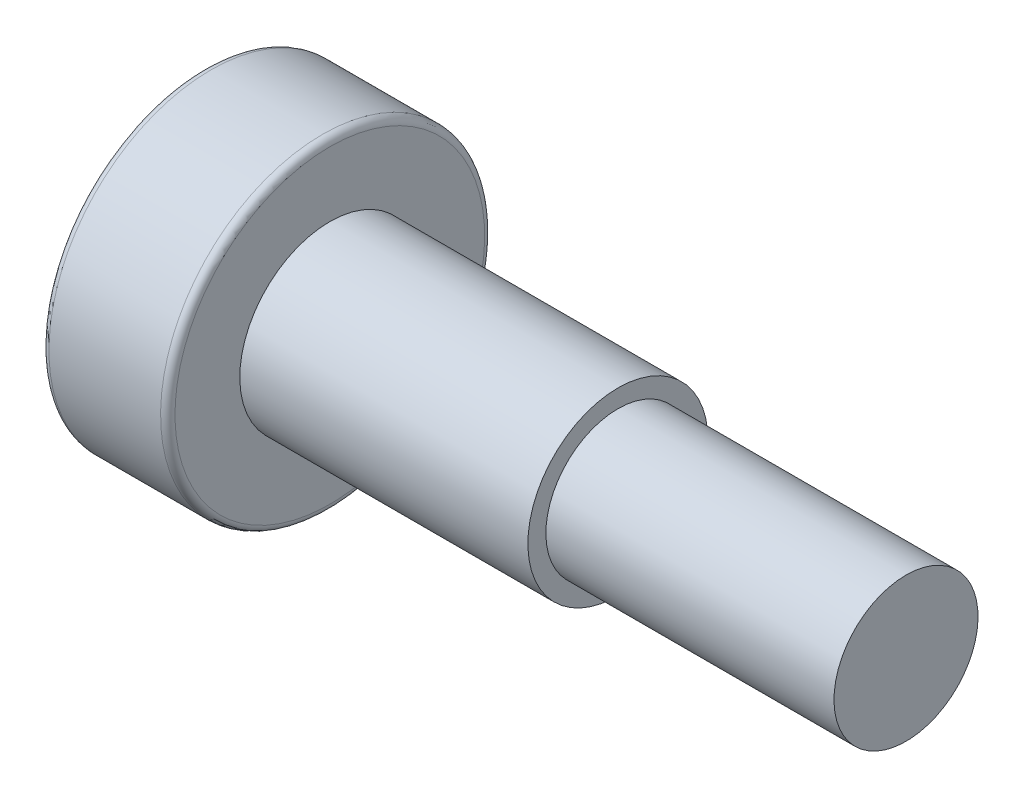
ISO-10303-21;
HEADER;
FILE_DESCRIPTION(('STEP AP214'),'2;1');
FILE_NAME('part.step','',(''),(''),'','','');
FILE_SCHEMA(('AUTOMOTIVE_DESIGN { 1 0 10303 214 1 1 1 1 }'));
ENDSEC;
DATA;
#1=APPLICATION_CONTEXT('core data for automotive mechanical design processes');
#2=APPLICATION_PROTOCOL_DEFINITION('international standard','automotive_design',2000,#1);
#3=PRODUCT_CONTEXT('',#1,'mechanical');
#4=PRODUCT('Part','Part','',(#3));
#5=PRODUCT_RELATED_PRODUCT_CATEGORY('part','',(#4));
#6=PRODUCT_DEFINITION_FORMATION('','',#4);
#7=PRODUCT_DEFINITION_CONTEXT('part definition',#1,'design');
#8=PRODUCT_DEFINITION('design','',#6,#7);
#9=PRODUCT_DEFINITION_SHAPE('','',#8);
#10=(LENGTH_UNIT() NAMED_UNIT(*) SI_UNIT(.MILLI.,.METRE.));
#11=(NAMED_UNIT(*) PLANE_ANGLE_UNIT() SI_UNIT($,.RADIAN.));
#12=(NAMED_UNIT(*) SI_UNIT($,.STERADIAN.) SOLID_ANGLE_UNIT());
#13=UNCERTAINTY_MEASURE_WITH_UNIT(LENGTH_MEASURE(1.E-05),#10,'distance_accuracy_value','');
#14=(GEOMETRIC_REPRESENTATION_CONTEXT(3) GLOBAL_UNCERTAINTY_ASSIGNED_CONTEXT((#13)) GLOBAL_UNIT_ASSIGNED_CONTEXT((#10,
#11,#12)) REPRESENTATION_CONTEXT('',''));
#15=CARTESIAN_POINT('',(0.,0.,0.));
#16=DIRECTION('',(0.,0.,1.));
#17=DIRECTION('',(1.,0.,0.));
#18=AXIS2_PLACEMENT_3D('',#15,#16,#17);
#19=CARTESIAN_POINT('',(0.,0.,0.));
#20=DIRECTION('',(-1.,0.,0.));
#21=DIRECTION('',(0.,-1.,0.));
#22=AXIS2_PLACEMENT_3D('',#19,#20,#21);
#23=PLANE('',#22);
#24=CARTESIAN_POINT('',(0.,0.,0.));
#25=DIRECTION('',(-1.,0.,0.));
#26=DIRECTION('',(0.,-1.,0.));
#27=AXIS2_PLACEMENT_3D('',#24,#25,#26);
#28=CIRCLE('',#27,4.3);
#29=CARTESIAN_POINT('',(0.,-4.3,0.));
#30=VERTEX_POINT('',#29);
#31=EDGE_CURVE('E48',#30,#30,#28,.T.);
#32=ORIENTED_EDGE('',*,*,#31,.T.);
#33=EDGE_LOOP('',(#32));
#34=FACE_BOUND('',#33,.T.);
#35=DIRECTION('',(0.,1.,0.));
#36=VECTOR('',#35,1.);
#37=CARTESIAN_POINT('',(0.,-0.866025403784439,1.5));
#38=LINE('',#37,#36);
#39=CARTESIAN_POINT('',(0.,-0.866025403784439,1.5));
#40=VERTEX_POINT('',#39);
#41=CARTESIAN_POINT('',(0.,0.866025403784439,1.5));
#42=VERTEX_POINT('',#41);
#43=EDGE_CURVE('E55',#40,#42,#38,.T.);
#44=ORIENTED_EDGE('',*,*,#43,.F.);
#45=DIRECTION('',(0.,0.5,0.866025403784439));
#46=VECTOR('',#45,1.);
#47=CARTESIAN_POINT('',(0.,-1.73205080756888,0.));
#48=LINE('',#47,#46);
#49=CARTESIAN_POINT('',(0.,-1.73205080756888,0.));
#50=VERTEX_POINT('',#49);
#51=EDGE_CURVE('E138',#50,#40,#48,.T.);
#52=ORIENTED_EDGE('',*,*,#51,.F.);
#53=DIRECTION('',(0.,-0.5,0.866025403784439));
#54=VECTOR('',#53,1.);
#55=CARTESIAN_POINT('',(0.,-0.866025403784438,-1.5));
#56=LINE('',#55,#54);
#57=CARTESIAN_POINT('',(0.,-0.866025403784438,-1.5));
#58=VERTEX_POINT('',#57);
#59=EDGE_CURVE('E136',#58,#50,#56,.T.);
#60=ORIENTED_EDGE('',*,*,#59,.F.);
#61=DIRECTION('',(0.,-1.,0.));
#62=VECTOR('',#61,1.);
#63=CARTESIAN_POINT('',(0.,0.866025403784439,-1.5));
#64=LINE('',#63,#62);
#65=CARTESIAN_POINT('',(0.,0.866025403784439,-1.5));
#66=VERTEX_POINT('',#65);
#67=EDGE_CURVE('E103',#66,#58,#64,.T.);
#68=ORIENTED_EDGE('',*,*,#67,.F.);
#69=DIRECTION('',(0.,-0.5,-0.866025403784439));
#70=VECTOR('',#69,1.);
#71=CARTESIAN_POINT('',(0.,1.73205080756888,0.));
#72=LINE('',#71,#70);
#73=CARTESIAN_POINT('',(0.,1.73205080756888,0.));
#74=VERTEX_POINT('',#73);
#75=EDGE_CURVE('E132',#74,#66,#72,.T.);
#76=ORIENTED_EDGE('',*,*,#75,.F.);
#77=DIRECTION('',(0.,0.5,-0.866025403784439));
#78=VECTOR('',#77,1.);
#79=CARTESIAN_POINT('',(0.,0.866025403784439,1.5));
#80=LINE('',#79,#78);
#81=EDGE_CURVE('E129',#42,#74,#80,.T.);
#82=ORIENTED_EDGE('',*,*,#81,.F.);
#83=EDGE_LOOP('',(#44,#52,#60,#68,#76,#82));
#84=FACE_BOUND('',#83,.T.);
#85=ADVANCED_FACE('F40',(#34,#84),#23,.T.);
#86=CARTESIAN_POINT('',(19.5,0.,0.));
#87=DIRECTION('',(1.,0.,0.));
#88=DIRECTION('',(0.,1.,0.));
#89=AXIS2_PLACEMENT_3D('',#86,#87,#88);
#90=CYLINDRICAL_SURFACE('',#89,4.5);
#91=CARTESIAN_POINT('',(0.199999999999999,0.,0.));
#92=DIRECTION('',(-1.,0.,0.));
#93=DIRECTION('',(0.,-1.,0.));
#94=AXIS2_PLACEMENT_3D('',#91,#92,#93);
#95=CIRCLE('',#94,4.5);
#96=CARTESIAN_POINT('',(0.2,-4.5,0.));
#97=VERTEX_POINT('',#96);
#98=EDGE_CURVE('E162',#97,#97,#95,.F.);
#99=ORIENTED_EDGE('',*,*,#98,.T.);
#100=EDGE_LOOP('',(#99));
#101=FACE_BOUND('',#100,.T.);
#102=CARTESIAN_POINT('',(3.3,0.,0.));
#103=DIRECTION('',(1.,0.,0.));
#104=DIRECTION('',(0.,1.,0.));
#105=AXIS2_PLACEMENT_3D('',#102,#103,#104);
#106=CIRCLE('',#105,4.5);
#107=CARTESIAN_POINT('',(3.3,4.5,0.));
#108=VERTEX_POINT('',#107);
#109=EDGE_CURVE('E159',#108,#108,#106,.F.);
#110=ORIENTED_EDGE('',*,*,#109,.T.);
#111=EDGE_LOOP('',(#110));
#112=FACE_BOUND('',#111,.T.);
#113=ADVANCED_FACE('F174',(#101,#112),#90,.T.);
#114=CARTESIAN_POINT('',(3.5,4.5,0.));
#115=DIRECTION('',(1.,0.,0.));
#116=DIRECTION('',(0.,1.,0.));
#117=AXIS2_PLACEMENT_3D('',#114,#115,#116);
#118=PLANE('',#117);
#119=CARTESIAN_POINT('',(3.5,0.,0.));
#120=DIRECTION('',(1.,0.,0.));
#121=DIRECTION('',(0.,1.,0.));
#122=AXIS2_PLACEMENT_3D('',#119,#120,#121);
#123=CIRCLE('',#122,4.3);
#124=CARTESIAN_POINT('',(3.5,4.3,0.));
#125=VERTEX_POINT('',#124);
#126=EDGE_CURVE('E11',#125,#125,#123,.T.);
#127=ORIENTED_EDGE('',*,*,#126,.T.);
#128=EDGE_LOOP('',(#127));
#129=FACE_BOUND('',#128,.T.);
#130=CARTESIAN_POINT('',(3.5,0.,0.));
#131=DIRECTION('',(1.,0.,0.));
#132=DIRECTION('',(0.,1.,0.));
#133=AXIS2_PLACEMENT_3D('',#130,#131,#132);
#134=CIRCLE('',#133,2.5);
#135=CARTESIAN_POINT('',(3.5,2.5,0.));
#136=VERTEX_POINT('',#135);
#137=EDGE_CURVE('E156',#136,#136,#134,.T.);
#138=ORIENTED_EDGE('',*,*,#137,.F.);
#139=EDGE_LOOP('',(#138));
#140=FACE_BOUND('',#139,.T.);
#141=ADVANCED_FACE('F177',(#129,#140),#118,.T.);
#142=CARTESIAN_POINT('',(19.5,0.,0.));
#143=DIRECTION('',(1.,0.,0.));
#144=DIRECTION('',(0.,1.,0.));
#145=AXIS2_PLACEMENT_3D('',#142,#143,#144);
#146=CYLINDRICAL_SURFACE('',#145,2.5);
#147=ORIENTED_EDGE('',*,*,#137,.T.);
#148=EDGE_LOOP('',(#147));
#149=FACE_BOUND('',#148,.T.);
#150=CARTESIAN_POINT('',(11.5,0.,0.));
#151=DIRECTION('',(1.,0.,0.));
#152=DIRECTION('',(0.,1.,0.));
#153=AXIS2_PLACEMENT_3D('',#150,#151,#152);
#154=CIRCLE('',#153,2.5);
#155=CARTESIAN_POINT('',(11.5,2.5,0.));
#156=VERTEX_POINT('',#155);
#157=EDGE_CURVE('E153',#156,#156,#154,.T.);
#158=ORIENTED_EDGE('',*,*,#157,.F.);
#159=EDGE_LOOP('',(#158));
#160=FACE_BOUND('',#159,.T.);
#161=ADVANCED_FACE('F187',(#149,#160),#146,.T.);
#162=CARTESIAN_POINT('',(11.5,2.5,0.));
#163=DIRECTION('',(1.,0.,0.));
#164=DIRECTION('',(0.,1.,0.));
#165=AXIS2_PLACEMENT_3D('',#162,#163,#164);
#166=PLANE('',#165);
#167=ORIENTED_EDGE('',*,*,#157,.T.);
#168=EDGE_LOOP('',(#167));
#169=FACE_BOUND('',#168,.T.);
#170=CARTESIAN_POINT('',(11.5,0.,0.));
#171=DIRECTION('',(1.,0.,0.));
#172=DIRECTION('',(0.,1.,0.));
#173=AXIS2_PLACEMENT_3D('',#170,#171,#172);
#174=CIRCLE('',#173,2.);
#175=CARTESIAN_POINT('',(11.5,2.,0.));
#176=VERTEX_POINT('',#175);
#177=EDGE_CURVE('E150',#176,#176,#174,.T.);
#178=ORIENTED_EDGE('',*,*,#177,.F.);
#179=EDGE_LOOP('',(#178));
#180=FACE_BOUND('',#179,.T.);
#181=ADVANCED_FACE('F193',(#169,#180),#166,.T.);
#182=CARTESIAN_POINT('',(19.5,0.,0.));
#183=DIRECTION('',(1.,0.,0.));
#184=DIRECTION('',(0.,1.,0.));
#185=AXIS2_PLACEMENT_3D('',#182,#183,#184);
#186=CYLINDRICAL_SURFACE('',#185,2.);
#187=ORIENTED_EDGE('',*,*,#177,.T.);
#188=EDGE_LOOP('',(#187));
#189=FACE_BOUND('',#188,.T.);
#190=CARTESIAN_POINT('',(19.5,0.,0.));
#191=DIRECTION('',(1.,0.,0.));
#192=DIRECTION('',(0.,1.,0.));
#193=AXIS2_PLACEMENT_3D('',#190,#191,#192);
#194=CIRCLE('',#193,2.);
#195=CARTESIAN_POINT('',(19.5,2.,0.));
#196=VERTEX_POINT('',#195);
#197=EDGE_CURVE('E142',#196,#196,#194,.T.);
#198=ORIENTED_EDGE('',*,*,#197,.F.);
#199=EDGE_LOOP('',(#198));
#200=FACE_BOUND('',#199,.T.);
#201=ADVANCED_FACE('F199',(#189,#200),#186,.T.);
#202=CARTESIAN_POINT('',(19.5,2.,0.));
#203=DIRECTION('',(1.,0.,0.));
#204=DIRECTION('',(0.,1.,0.));
#205=AXIS2_PLACEMENT_3D('',#202,#203,#204);
#206=PLANE('',#205);
#207=ORIENTED_EDGE('',*,*,#197,.T.);
#208=EDGE_LOOP('',(#207));
#209=FACE_BOUND('',#208,.T.);
#210=ADVANCED_FACE('F205',(#209),#206,.T.);
#211=CARTESIAN_POINT('',(2.,-0.866025403784439,1.5));
#212=DIRECTION('',(0.,0.,1.));
#213=DIRECTION('',(1.,0.,0.));
#214=AXIS2_PLACEMENT_3D('',#211,#212,#213);
#215=PLANE('',#214);
#216=ORIENTED_EDGE('',*,*,#43,.T.);
#217=DIRECTION('',(-1.,0.,0.));
#218=VECTOR('',#217,1.);
#219=CARTESIAN_POINT('',(2.,0.866025403784439,1.5));
#220=LINE('',#219,#218);
#221=CARTESIAN_POINT('',(2.,0.866025403784439,1.5));
#222=VERTEX_POINT('',#221);
#223=EDGE_CURVE('E85',#222,#42,#220,.T.);
#224=ORIENTED_EDGE('',*,*,#223,.F.);
#225=DIRECTION('',(0.,1.,0.));
#226=VECTOR('',#225,1.);
#227=CARTESIAN_POINT('',(2.,-0.866025403784439,1.5));
#228=LINE('',#227,#226);
#229=CARTESIAN_POINT('',(2.,-0.866025403784439,1.5));
#230=VERTEX_POINT('',#229);
#231=EDGE_CURVE('E140',#230,#222,#228,.T.);
#232=ORIENTED_EDGE('',*,*,#231,.F.);
#233=DIRECTION('',(-1.,0.,0.));
#234=VECTOR('',#233,1.);
#235=CARTESIAN_POINT('',(2.,-0.866025403784439,1.5));
#236=LINE('',#235,#234);
#237=EDGE_CURVE('E63',#230,#40,#236,.T.);
#238=ORIENTED_EDGE('',*,*,#237,.T.);
#239=EDGE_LOOP('',(#216,#224,#232,#238));
#240=FACE_BOUND('',#239,.T.);
#241=ADVANCED_FACE('F210',(#240),#215,.F.);
#242=CARTESIAN_POINT('',(2.,-1.73205080756888,0.));
#243=DIRECTION('',(0.,-0.866025403784439,0.5));
#244=DIRECTION('',(0.,-0.5,-0.866025403784439));
#245=AXIS2_PLACEMENT_3D('',#242,#243,#244);
#246=PLANE('',#245);
#247=ORIENTED_EDGE('',*,*,#51,.T.);
#248=ORIENTED_EDGE('',*,*,#237,.F.);
#249=DIRECTION('',(0.,0.5,0.866025403784439));
#250=VECTOR('',#249,1.);
#251=CARTESIAN_POINT('',(2.,-1.73205080756888,0.));
#252=LINE('',#251,#250);
#253=CARTESIAN_POINT('',(2.,-1.73205080756888,0.));
#254=VERTEX_POINT('',#253);
#255=EDGE_CURVE('E115',#254,#230,#252,.T.);
#256=ORIENTED_EDGE('',*,*,#255,.F.);
#257=DIRECTION('',(-1.,0.,0.));
#258=VECTOR('',#257,1.);
#259=CARTESIAN_POINT('',(2.,-1.73205080756888,0.));
#260=LINE('',#259,#258);
#261=EDGE_CURVE('E107',#254,#50,#260,.T.);
#262=ORIENTED_EDGE('',*,*,#261,.T.);
#263=EDGE_LOOP('',(#247,#248,#256,#262));
#264=FACE_BOUND('',#263,.T.);
#265=ADVANCED_FACE('F215',(#264),#246,.F.);
#266=CARTESIAN_POINT('',(2.,-0.866025403784438,-1.5));
#267=DIRECTION('',(0.,-0.866025403784439,-0.5));
#268=DIRECTION('',(0.,0.5,-0.866025403784439));
#269=AXIS2_PLACEMENT_3D('',#266,#267,#268);
#270=PLANE('',#269);
#271=ORIENTED_EDGE('',*,*,#59,.T.);
#272=ORIENTED_EDGE('',*,*,#261,.F.);
#273=DIRECTION('',(0.,-0.5,0.866025403784439));
#274=VECTOR('',#273,1.);
#275=CARTESIAN_POINT('',(2.,-0.866025403784438,-1.5));
#276=LINE('',#275,#274);
#277=CARTESIAN_POINT('',(2.,-0.866025403784438,-1.5));
#278=VERTEX_POINT('',#277);
#279=EDGE_CURVE('E111',#278,#254,#276,.T.);
#280=ORIENTED_EDGE('',*,*,#279,.F.);
#281=DIRECTION('',(-1.,0.,0.));
#282=VECTOR('',#281,1.);
#283=CARTESIAN_POINT('',(2.,-0.866025403784438,-1.5));
#284=LINE('',#283,#282);
#285=EDGE_CURVE('E96',#278,#58,#284,.T.);
#286=ORIENTED_EDGE('',*,*,#285,.T.);
#287=EDGE_LOOP('',(#271,#272,#280,#286));
#288=FACE_BOUND('',#287,.T.);
#289=ADVANCED_FACE('F112',(#288),#270,.F.);
#290=CARTESIAN_POINT('',(2.,0.866025403784439,-1.5));
#291=DIRECTION('',(0.,0.,-1.));
#292=DIRECTION('',(0.,1.,0.));
#293=AXIS2_PLACEMENT_3D('',#290,#291,#292);
#294=PLANE('',#293);
#295=ORIENTED_EDGE('',*,*,#67,.T.);
#296=ORIENTED_EDGE('',*,*,#285,.F.);
#297=DIRECTION('',(0.,-1.,0.));
#298=VECTOR('',#297,1.);
#299=CARTESIAN_POINT('',(2.,0.866025403784439,-1.5));
#300=LINE('',#299,#298);
#301=CARTESIAN_POINT('',(2.,0.866025403784439,-1.5));
#302=VERTEX_POINT('',#301);
#303=EDGE_CURVE('E100',#302,#278,#300,.T.);
#304=ORIENTED_EDGE('',*,*,#303,.F.);
#305=DIRECTION('',(-1.,0.,0.));
#306=VECTOR('',#305,1.);
#307=CARTESIAN_POINT('',(2.,0.866025403784439,-1.5));
#308=LINE('',#307,#306);
#309=EDGE_CURVE('E108',#302,#66,#308,.T.);
#310=ORIENTED_EDGE('',*,*,#309,.T.);
#311=EDGE_LOOP('',(#295,#296,#304,#310));
#312=FACE_BOUND('',#311,.T.);
#313=ADVANCED_FACE('F98',(#312),#294,.F.);
#314=CARTESIAN_POINT('',(2.,1.73205080756888,0.));
#315=DIRECTION('',(0.,0.866025403784439,-0.5));
#316=DIRECTION('',(0.,0.5,0.866025403784439));
#317=AXIS2_PLACEMENT_3D('',#314,#315,#316);
#318=PLANE('',#317);
#319=ORIENTED_EDGE('',*,*,#75,.T.);
#320=ORIENTED_EDGE('',*,*,#309,.F.);
#321=DIRECTION('',(0.,-0.5,-0.866025403784439));
#322=VECTOR('',#321,1.);
#323=CARTESIAN_POINT('',(2.,1.73205080756888,0.));
#324=LINE('',#323,#322);
#325=CARTESIAN_POINT('',(2.,1.73205080756888,0.));
#326=VERTEX_POINT('',#325);
#327=EDGE_CURVE('E121',#326,#302,#324,.T.);
#328=ORIENTED_EDGE('',*,*,#327,.F.);
#329=DIRECTION('',(-1.,0.,0.));
#330=VECTOR('',#329,1.);
#331=CARTESIAN_POINT('',(2.,1.73205080756888,0.));
#332=LINE('',#331,#330);
#333=EDGE_CURVE('E145',#326,#74,#332,.T.);
#334=ORIENTED_EDGE('',*,*,#333,.T.);
#335=EDGE_LOOP('',(#319,#320,#328,#334));
#336=FACE_BOUND('',#335,.T.);
#337=ADVANCED_FACE('F286',(#336),#318,.F.);
#338=CARTESIAN_POINT('',(2.,0.866025403784439,1.5));
#339=DIRECTION('',(0.,0.866025403784439,0.5));
#340=DIRECTION('',(0.,-0.5,0.866025403784439));
#341=AXIS2_PLACEMENT_3D('',#338,#339,#340);
#342=PLANE('',#341);
#343=ORIENTED_EDGE('',*,*,#81,.T.);
#344=ORIENTED_EDGE('',*,*,#333,.F.);
#345=DIRECTION('',(0.,0.5,-0.866025403784439));
#346=VECTOR('',#345,1.);
#347=CARTESIAN_POINT('',(2.,0.866025403784439,1.5));
#348=LINE('',#347,#346);
#349=EDGE_CURVE('E123',#222,#326,#348,.T.);
#350=ORIENTED_EDGE('',*,*,#349,.F.);
#351=ORIENTED_EDGE('',*,*,#223,.T.);
#352=EDGE_LOOP('',(#343,#344,#350,#351));
#353=FACE_BOUND('',#352,.T.);
#354=ADVANCED_FACE('F294',(#353),#342,.F.);
#355=CARTESIAN_POINT('',(2.,0.,0.));
#356=DIRECTION('',(-1.,0.,0.));
#357=DIRECTION('',(0.,-1.,0.));
#358=AXIS2_PLACEMENT_3D('',#355,#356,#357);
#359=PLANE('',#358);
#360=ORIENTED_EDGE('',*,*,#231,.T.);
#361=ORIENTED_EDGE('',*,*,#349,.T.);
#362=ORIENTED_EDGE('',*,*,#327,.T.);
#363=ORIENTED_EDGE('',*,*,#303,.T.);
#364=ORIENTED_EDGE('',*,*,#279,.T.);
#365=ORIENTED_EDGE('',*,*,#255,.T.);
#366=EDGE_LOOP('',(#360,#361,#362,#363,#364,#365));
#367=FACE_BOUND('',#366,.T.);
#368=ADVANCED_FACE('F118',(#367),#359,.T.);
#369=CARTESIAN_POINT('',(0.199999999999999,0.,0.));
#370=DIRECTION('',(-1.,0.,0.));
#371=DIRECTION('',(0.,-1.,0.));
#372=AXIS2_PLACEMENT_3D('',#369,#370,#371);
#373=TOROIDAL_SURFACE('',#372,4.3,0.2);
#374=ORIENTED_EDGE('',*,*,#31,.F.);
#375=EDGE_LOOP('',(#374));
#376=FACE_BOUND('',#375,.T.);
#377=ORIENTED_EDGE('',*,*,#98,.F.);
#378=EDGE_LOOP('',(#377));
#379=FACE_BOUND('',#378,.T.);
#380=ADVANCED_FACE('F169',(#376,#379),#373,.T.);
#381=CARTESIAN_POINT('',(3.3,0.,0.));
#382=DIRECTION('',(1.,0.,0.));
#383=DIRECTION('',(0.,1.,0.));
#384=AXIS2_PLACEMENT_3D('',#381,#382,#383);
#385=TOROIDAL_SURFACE('',#384,4.3,0.2);
#386=ORIENTED_EDGE('',*,*,#109,.F.);
#387=EDGE_LOOP('',(#386));
#388=FACE_BOUND('',#387,.T.);
#389=ORIENTED_EDGE('',*,*,#126,.F.);
#390=EDGE_LOOP('',(#389));
#391=FACE_BOUND('',#390,.T.);
#392=ADVANCED_FACE('F42',(#388,#391),#385,.T.);
#393=CLOSED_SHELL('',(#85,#113,#141,#161,#181,#201,#210,#241,#265,#289,#313,#337,#354,#368,#380,#392));
#394=MANIFOLD_SOLID_BREP('B2',#393);
#395=ADVANCED_BREP_SHAPE_REPRESENTATION('',(#18,#394),#14);
#396=SHAPE_DEFINITION_REPRESENTATION(#9,#395);
ENDSEC;
END-ISO-10303-21;
